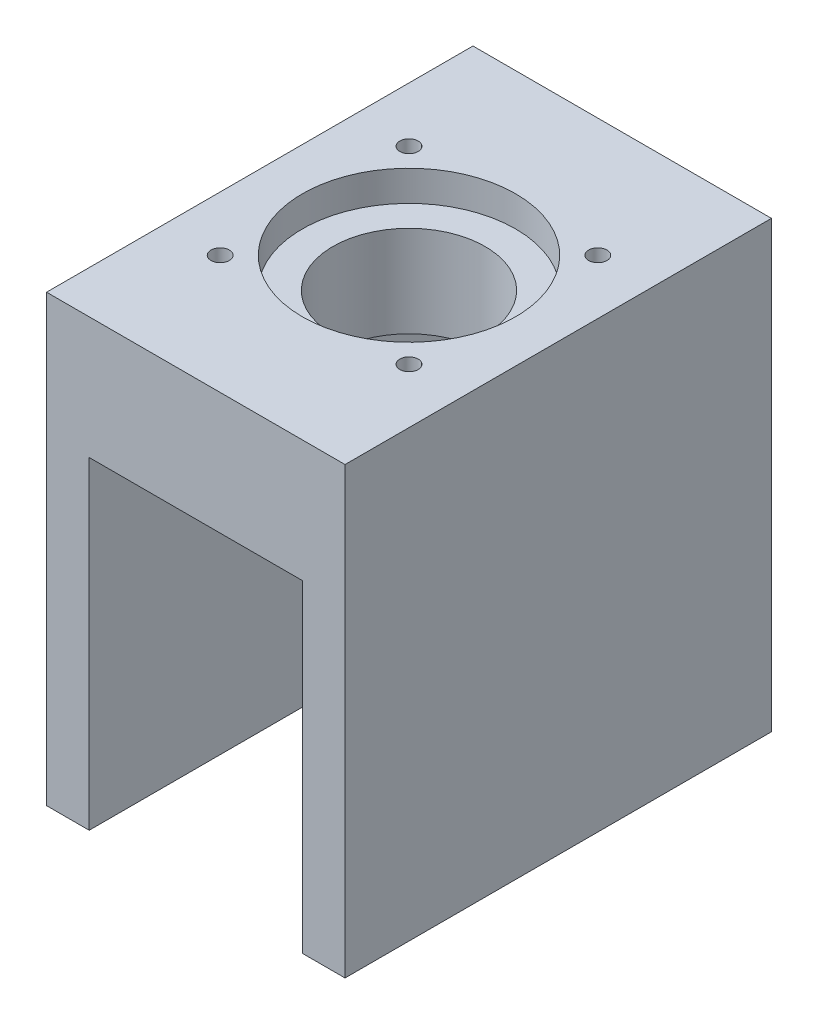
ISO-10303-21;
HEADER;
FILE_DESCRIPTION(('STEP AP214'),'2;1');
FILE_NAME('part.step','',(''),(''),'','','');
FILE_SCHEMA(('AUTOMOTIVE_DESIGN { 1 0 10303 214 1 1 1 1 }'));
ENDSEC;
DATA;
#1=APPLICATION_CONTEXT('core data for automotive mechanical design processes');
#2=APPLICATION_PROTOCOL_DEFINITION('international standard','automotive_design',2000,#1);
#3=PRODUCT_CONTEXT('',#1,'mechanical');
#4=PRODUCT('Part','Part','',(#3));
#5=PRODUCT_RELATED_PRODUCT_CATEGORY('part','',(#4));
#6=PRODUCT_DEFINITION_FORMATION('','',#4);
#7=PRODUCT_DEFINITION_CONTEXT('part definition',#1,'design');
#8=PRODUCT_DEFINITION('design','',#6,#7);
#9=PRODUCT_DEFINITION_SHAPE('','',#8);
#10=(LENGTH_UNIT() NAMED_UNIT(*) SI_UNIT(.MILLI.,.METRE.));
#11=(NAMED_UNIT(*) PLANE_ANGLE_UNIT() SI_UNIT($,.RADIAN.));
#12=(NAMED_UNIT(*) SI_UNIT($,.STERADIAN.) SOLID_ANGLE_UNIT());
#13=UNCERTAINTY_MEASURE_WITH_UNIT(LENGTH_MEASURE(1.E-05),#10,'distance_accuracy_value','');
#14=(GEOMETRIC_REPRESENTATION_CONTEXT(3) GLOBAL_UNCERTAINTY_ASSIGNED_CONTEXT((#13)) GLOBAL_UNIT_ASSIGNED_CONTEXT((#10,
#11,#12)) REPRESENTATION_CONTEXT('',''));
#15=CARTESIAN_POINT('',(0.,0.,0.));
#16=DIRECTION('',(0.,0.,1.));
#17=DIRECTION('',(1.,0.,0.));
#18=AXIS2_PLACEMENT_3D('',#15,#16,#17);
#19=CARTESIAN_POINT('',(0.,0.,0.));
#20=DIRECTION('',(0.,1.,0.));
#21=DIRECTION('',(0.,0.,1.));
#22=AXIS2_PLACEMENT_3D('',#19,#20,#21);
#23=PLANE('',#22);
#24=CARTESIAN_POINT('',(-15.4999999999991,0.,-15.4999999999991));
#25=DIRECTION('',(0.,-1.,0.));
#26=DIRECTION('',(0.,0.,-1.));
#27=AXIS2_PLACEMENT_3D('',#24,#25,#26);
#28=CIRCLE('',#27,1.50000000000093);
#29=CARTESIAN_POINT('',(-15.4999999999991,0.,-17.0000000000001));
#30=VERTEX_POINT('',#29);
#31=EDGE_CURVE('E157',#30,#30,#28,.T.);
#32=ORIENTED_EDGE('',*,*,#31,.F.);
#33=EDGE_LOOP('',(#32));
#34=FACE_BOUND('',#33,.T.);
#35=CARTESIAN_POINT('',(15.5,0.,-15.4999999999991));
#36=DIRECTION('',(0.,-1.,0.));
#37=DIRECTION('',(0.,0.,-1.));
#38=AXIS2_PLACEMENT_3D('',#35,#36,#37);
#39=CIRCLE('',#38,1.50000000000168);
#40=CARTESIAN_POINT('',(15.5,0.,-17.0000000000008));
#41=VERTEX_POINT('',#40);
#42=EDGE_CURVE('E170',#41,#41,#39,.T.);
#43=ORIENTED_EDGE('',*,*,#42,.F.);
#44=EDGE_LOOP('',(#43));
#45=FACE_BOUND('',#44,.T.);
#46=CARTESIAN_POINT('',(15.5,0.,15.5));
#47=DIRECTION('',(0.,-1.,0.));
#48=DIRECTION('',(0.,0.,-1.));
#49=AXIS2_PLACEMENT_3D('',#46,#47,#48);
#50=CIRCLE('',#49,1.50000000000135);
#51=CARTESIAN_POINT('',(15.5,0.,13.9999999999986));
#52=VERTEX_POINT('',#51);
#53=EDGE_CURVE('E164',#52,#52,#50,.T.);
#54=ORIENTED_EDGE('',*,*,#53,.F.);
#55=EDGE_LOOP('',(#54));
#56=FACE_BOUND('',#55,.T.);
#57=CARTESIAN_POINT('',(-15.4999999999991,0.,15.5));
#58=DIRECTION('',(0.,-1.,0.));
#59=DIRECTION('',(0.,0.,-1.));
#60=AXIS2_PLACEMENT_3D('',#57,#58,#59);
#61=CIRCLE('',#60,1.50000000000046);
#62=CARTESIAN_POINT('',(-15.4999999999991,0.,13.9999999999995));
#63=VERTEX_POINT('',#62);
#64=EDGE_CURVE('E163',#63,#63,#61,.T.);
#65=ORIENTED_EDGE('',*,*,#64,.F.);
#66=EDGE_LOOP('',(#65));
#67=FACE_BOUND('',#66,.T.);
#68=CARTESIAN_POINT('',(0.,0.,0.));
#69=DIRECTION('',(0.,1.,0.));
#70=DIRECTION('',(0.,0.,1.));
#71=AXIS2_PLACEMENT_3D('',#68,#69,#70);
#72=CIRCLE('',#71,12.5);
#73=CARTESIAN_POINT('',(0.,0.,12.5));
#74=VERTEX_POINT('',#73);
#75=EDGE_CURVE('E39',#74,#74,#72,.T.);
#76=ORIENTED_EDGE('',*,*,#75,.T.);
#77=EDGE_LOOP('',(#76));
#78=FACE_BOUND('',#77,.T.);
#79=DIRECTION('',(0.,0.,-1.));
#80=VECTOR('',#79,1.);
#81=CARTESIAN_POINT('',(17.5,0.,35.));
#82=LINE('',#81,#80);
#83=CARTESIAN_POINT('',(17.5,0.,35.));
#84=VERTEX_POINT('',#83);
#85=CARTESIAN_POINT('',(17.5,0.,-35.));
#86=VERTEX_POINT('',#85);
#87=EDGE_CURVE('E123',#84,#86,#82,.T.);
#88=ORIENTED_EDGE('',*,*,#87,.F.);
#89=DIRECTION('',(1.,0.,0.));
#90=VECTOR('',#89,1.);
#91=CARTESIAN_POINT('',(24.5,0.,35.));
#92=LINE('',#91,#90);
#93=CARTESIAN_POINT('',(-17.5,0.,35.));
#94=VERTEX_POINT('',#93);
#95=EDGE_CURVE('E192',#94,#84,#92,.T.);
#96=ORIENTED_EDGE('',*,*,#95,.F.);
#97=DIRECTION('',(0.,0.,1.));
#98=VECTOR('',#97,1.);
#99=CARTESIAN_POINT('',(-17.5,0.,35.));
#100=LINE('',#99,#98);
#101=CARTESIAN_POINT('',(-17.5,0.,-35.));
#102=VERTEX_POINT('',#101);
#103=EDGE_CURVE('E131',#102,#94,#100,.T.);
#104=ORIENTED_EDGE('',*,*,#103,.F.);
#105=DIRECTION('',(-1.,0.,0.));
#106=VECTOR('',#105,1.);
#107=CARTESIAN_POINT('',(24.5,0.,-35.));
#108=LINE('',#107,#106);
#109=EDGE_CURVE('E56',#86,#102,#108,.T.);
#110=ORIENTED_EDGE('',*,*,#109,.F.);
#111=EDGE_LOOP('',(#88,#96,#104,#110));
#112=FACE_BOUND('',#111,.T.);
#113=ADVANCED_FACE('F35',(#34,#45,#56,#67,#78,#112),#23,.F.);
#114=CARTESIAN_POINT('',(0.,-50.,0.));
#115=DIRECTION('',(0.,1.,0.));
#116=DIRECTION('',(0.,0.,1.));
#117=AXIS2_PLACEMENT_3D('',#114,#115,#116);
#118=CYLINDRICAL_SURFACE('',#117,12.5);
#119=ORIENTED_EDGE('',*,*,#75,.F.);
#120=EDGE_LOOP('',(#119));
#121=FACE_BOUND('',#120,.T.);
#122=CARTESIAN_POINT('',(0.,15.,0.));
#123=DIRECTION('',(0.,1.,0.));
#124=DIRECTION('',(0.,0.,1.));
#125=AXIS2_PLACEMENT_3D('',#122,#123,#124);
#126=CIRCLE('',#125,12.5);
#127=CARTESIAN_POINT('',(0.,15.,12.5));
#128=VERTEX_POINT('',#127);
#129=EDGE_CURVE('E150',#128,#128,#126,.T.);
#130=ORIENTED_EDGE('',*,*,#129,.T.);
#131=EDGE_LOOP('',(#130));
#132=FACE_BOUND('',#131,.T.);
#133=ADVANCED_FACE('F226',(#121,#132),#118,.F.);
#134=CARTESIAN_POINT('',(-24.5,20.,35.));
#135=DIRECTION('',(1.,0.,0.));
#136=DIRECTION('',(0.,0.,-1.));
#137=AXIS2_PLACEMENT_3D('',#134,#135,#136);
#138=PLANE('',#137);
#139=DIRECTION('',(0.,-1.,0.));
#140=VECTOR('',#139,1.);
#141=CARTESIAN_POINT('',(-24.5,20.,-35.));
#142=LINE('',#141,#140);
#143=CARTESIAN_POINT('',(-24.5,20.,-35.));
#144=VERTEX_POINT('',#143);
#145=CARTESIAN_POINT('',(-24.5,-53.,-35.));
#146=VERTEX_POINT('',#145);
#147=EDGE_CURVE('E191',#144,#146,#142,.T.);
#148=ORIENTED_EDGE('',*,*,#147,.T.);
#149=DIRECTION('',(0.,0.,-1.));
#150=VECTOR('',#149,1.);
#151=CARTESIAN_POINT('',(-24.5,-53.,35.));
#152=LINE('',#151,#150);
#153=CARTESIAN_POINT('',(-24.5,-53.,35.));
#154=VERTEX_POINT('',#153);
#155=EDGE_CURVE('E132',#154,#146,#152,.T.);
#156=ORIENTED_EDGE('',*,*,#155,.F.);
#157=DIRECTION('',(0.,-1.,0.));
#158=VECTOR('',#157,1.);
#159=CARTESIAN_POINT('',(-24.5,20.,35.));
#160=LINE('',#159,#158);
#161=CARTESIAN_POINT('',(-24.5,20.,35.));
#162=VERTEX_POINT('',#161);
#163=EDGE_CURVE('E11',#162,#154,#160,.T.);
#164=ORIENTED_EDGE('',*,*,#163,.F.);
#165=DIRECTION('',(0.,0.,1.));
#166=VECTOR('',#165,1.);
#167=CARTESIAN_POINT('',(-24.5,20.,35.));
#168=LINE('',#167,#166);
#169=EDGE_CURVE('E183',#144,#162,#168,.T.);
#170=ORIENTED_EDGE('',*,*,#169,.F.);
#171=EDGE_LOOP('',(#148,#156,#164,#170));
#172=FACE_BOUND('',#171,.T.);
#173=ADVANCED_FACE('F37',(#172),#138,.F.);
#174=CARTESIAN_POINT('',(24.5,20.,35.));
#175=DIRECTION('',(0.,0.,-1.));
#176=DIRECTION('',(-1.,0.,0.));
#177=AXIS2_PLACEMENT_3D('',#174,#175,#176);
#178=PLANE('',#177);
#179=ORIENTED_EDGE('',*,*,#163,.T.);
#180=DIRECTION('',(-1.,0.,0.));
#181=VECTOR('',#180,1.);
#182=CARTESIAN_POINT('',(-24.5,-53.,35.));
#183=LINE('',#182,#181);
#184=CARTESIAN_POINT('',(-17.5,-53.,35.));
#185=VERTEX_POINT('',#184);
#186=EDGE_CURVE('E139',#185,#154,#183,.T.);
#187=ORIENTED_EDGE('',*,*,#186,.F.);
#188=DIRECTION('',(0.,1.,0.));
#189=VECTOR('',#188,1.);
#190=CARTESIAN_POINT('',(-17.5,-53.,35.));
#191=LINE('',#190,#189);
#192=EDGE_CURVE('E142',#185,#94,#191,.T.);
#193=ORIENTED_EDGE('',*,*,#192,.T.);
#194=ORIENTED_EDGE('',*,*,#95,.T.);
#195=DIRECTION('',(0.,1.,0.));
#196=VECTOR('',#195,1.);
#197=CARTESIAN_POINT('',(17.5,-53.,35.));
#198=LINE('',#197,#196);
#199=CARTESIAN_POINT('',(17.5,-53.,35.));
#200=VERTEX_POINT('',#199);
#201=EDGE_CURVE('E115',#200,#84,#198,.T.);
#202=ORIENTED_EDGE('',*,*,#201,.F.);
#203=DIRECTION('',(-1.,0.,0.));
#204=VECTOR('',#203,1.);
#205=CARTESIAN_POINT('',(24.5,-53.,35.));
#206=LINE('',#205,#204);
#207=CARTESIAN_POINT('',(24.5,-53.,35.));
#208=VERTEX_POINT('',#207);
#209=EDGE_CURVE('E112',#208,#200,#206,.T.);
#210=ORIENTED_EDGE('',*,*,#209,.F.);
#211=DIRECTION('',(0.,-1.,0.));
#212=VECTOR('',#211,1.);
#213=CARTESIAN_POINT('',(24.5,20.,35.));
#214=LINE('',#213,#212);
#215=CARTESIAN_POINT('',(24.5,20.,35.));
#216=VERTEX_POINT('',#215);
#217=EDGE_CURVE('E44',#216,#208,#214,.T.);
#218=ORIENTED_EDGE('',*,*,#217,.F.);
#219=DIRECTION('',(1.,0.,0.));
#220=VECTOR('',#219,1.);
#221=CARTESIAN_POINT('',(24.5,20.,35.));
#222=LINE('',#221,#220);
#223=EDGE_CURVE('E186',#162,#216,#222,.T.);
#224=ORIENTED_EDGE('',*,*,#223,.F.);
#225=EDGE_LOOP('',(#179,#187,#193,#194,#202,#210,#218,#224));
#226=FACE_BOUND('',#225,.T.);
#227=ADVANCED_FACE('F113',(#226),#178,.F.);
#228=CARTESIAN_POINT('',(24.5,20.,35.));
#229=DIRECTION('',(-1.,0.,0.));
#230=DIRECTION('',(0.,0.,1.));
#231=AXIS2_PLACEMENT_3D('',#228,#229,#230);
#232=PLANE('',#231);
#233=ORIENTED_EDGE('',*,*,#217,.T.);
#234=DIRECTION('',(0.,0.,1.));
#235=VECTOR('',#234,1.);
#236=CARTESIAN_POINT('',(24.5,-53.,35.));
#237=LINE('',#236,#235);
#238=CARTESIAN_POINT('',(24.5,-53.,-35.));
#239=VERTEX_POINT('',#238);
#240=EDGE_CURVE('E106',#239,#208,#237,.T.);
#241=ORIENTED_EDGE('',*,*,#240,.F.);
#242=DIRECTION('',(0.,-1.,0.));
#243=VECTOR('',#242,1.);
#244=CARTESIAN_POINT('',(24.5,20.,-35.));
#245=LINE('',#244,#243);
#246=CARTESIAN_POINT('',(24.5,20.,-35.));
#247=VERTEX_POINT('',#246);
#248=EDGE_CURVE('E109',#247,#239,#245,.T.);
#249=ORIENTED_EDGE('',*,*,#248,.F.);
#250=DIRECTION('',(0.,0.,-1.));
#251=VECTOR('',#250,1.);
#252=CARTESIAN_POINT('',(24.5,20.,35.));
#253=LINE('',#252,#251);
#254=EDGE_CURVE('E107',#216,#247,#253,.T.);
#255=ORIENTED_EDGE('',*,*,#254,.F.);
#256=EDGE_LOOP('',(#233,#241,#249,#255));
#257=FACE_BOUND('',#256,.T.);
#258=ADVANCED_FACE('F103',(#257),#232,.F.);
#259=CARTESIAN_POINT('',(24.5,20.,-35.));
#260=DIRECTION('',(0.,0.,1.));
#261=DIRECTION('',(1.,0.,0.));
#262=AXIS2_PLACEMENT_3D('',#259,#260,#261);
#263=PLANE('',#262);
#264=ORIENTED_EDGE('',*,*,#248,.T.);
#265=DIRECTION('',(1.,0.,0.));
#266=VECTOR('',#265,1.);
#267=CARTESIAN_POINT('',(24.5,-53.,-35.));
#268=LINE('',#267,#266);
#269=CARTESIAN_POINT('',(17.5,-53.,-35.));
#270=VERTEX_POINT('',#269);
#271=EDGE_CURVE('E122',#270,#239,#268,.T.);
#272=ORIENTED_EDGE('',*,*,#271,.F.);
#273=DIRECTION('',(0.,1.,0.));
#274=VECTOR('',#273,1.);
#275=CARTESIAN_POINT('',(17.5,-53.,-35.));
#276=LINE('',#275,#274);
#277=EDGE_CURVE('E51',#270,#86,#276,.T.);
#278=ORIENTED_EDGE('',*,*,#277,.T.);
#279=ORIENTED_EDGE('',*,*,#109,.T.);
#280=DIRECTION('',(0.,1.,0.));
#281=VECTOR('',#280,1.);
#282=CARTESIAN_POINT('',(-17.5,-53.,-35.));
#283=LINE('',#282,#281);
#284=CARTESIAN_POINT('',(-17.5,-53.,-35.));
#285=VERTEX_POINT('',#284);
#286=EDGE_CURVE('E147',#285,#102,#283,.T.);
#287=ORIENTED_EDGE('',*,*,#286,.F.);
#288=DIRECTION('',(1.,0.,0.));
#289=VECTOR('',#288,1.);
#290=CARTESIAN_POINT('',(-24.5,-53.,-35.));
#291=LINE('',#290,#289);
#292=EDGE_CURVE('E135',#146,#285,#291,.T.);
#293=ORIENTED_EDGE('',*,*,#292,.F.);
#294=ORIENTED_EDGE('',*,*,#147,.F.);
#295=DIRECTION('',(-1.,0.,0.));
#296=VECTOR('',#295,1.);
#297=CARTESIAN_POINT('',(24.5,20.,-35.));
#298=LINE('',#297,#296);
#299=EDGE_CURVE('E189',#247,#144,#298,.T.);
#300=ORIENTED_EDGE('',*,*,#299,.F.);
#301=EDGE_LOOP('',(#264,#272,#278,#279,#287,#293,#294,#300));
#302=FACE_BOUND('',#301,.T.);
#303=ADVANCED_FACE('F197',(#302),#263,.F.);
#304=CARTESIAN_POINT('',(0.,20.,0.));
#305=DIRECTION('',(0.,1.,0.));
#306=DIRECTION('',(0.,0.,1.));
#307=AXIS2_PLACEMENT_3D('',#304,#305,#306);
#308=PLANE('',#307);
#309=CARTESIAN_POINT('',(0.,20.,0.));
#310=DIRECTION('',(0.,1.,0.));
#311=DIRECTION('',(0.,0.,1.));
#312=AXIS2_PLACEMENT_3D('',#309,#310,#311);
#313=CIRCLE('',#312,17.5);
#314=CARTESIAN_POINT('',(0.,20.,17.5));
#315=VERTEX_POINT('',#314);
#316=EDGE_CURVE('E153',#315,#315,#313,.T.);
#317=ORIENTED_EDGE('',*,*,#316,.F.);
#318=EDGE_LOOP('',(#317));
#319=FACE_BOUND('',#318,.T.);
#320=CARTESIAN_POINT('',(-15.4999999999991,20.,-15.4999999999991));
#321=DIRECTION('',(0.,-1.,0.));
#322=DIRECTION('',(0.,0.,-1.));
#323=AXIS2_PLACEMENT_3D('',#320,#321,#322);
#324=CIRCLE('',#323,1.50000000000093);
#325=CARTESIAN_POINT('',(-15.4999999999991,20.,-17.0000000000001));
#326=VERTEX_POINT('',#325);
#327=EDGE_CURVE('E173',#326,#326,#324,.T.);
#328=ORIENTED_EDGE('',*,*,#327,.T.);
#329=EDGE_LOOP('',(#328));
#330=FACE_BOUND('',#329,.T.);
#331=CARTESIAN_POINT('',(15.5,20.,-15.4999999999991));
#332=DIRECTION('',(0.,-1.,0.));
#333=DIRECTION('',(0.,0.,-1.));
#334=AXIS2_PLACEMENT_3D('',#331,#332,#333);
#335=CIRCLE('',#334,1.50000000000168);
#336=CARTESIAN_POINT('',(15.5,20.,-17.0000000000008));
#337=VERTEX_POINT('',#336);
#338=EDGE_CURVE('E167',#337,#337,#335,.T.);
#339=ORIENTED_EDGE('',*,*,#338,.T.);
#340=EDGE_LOOP('',(#339));
#341=FACE_BOUND('',#340,.T.);
#342=CARTESIAN_POINT('',(15.5,20.,15.5));
#343=DIRECTION('',(0.,-1.,0.));
#344=DIRECTION('',(0.,0.,-1.));
#345=AXIS2_PLACEMENT_3D('',#342,#343,#344);
#346=CIRCLE('',#345,1.50000000000135);
#347=CARTESIAN_POINT('',(15.5,20.,13.9999999999986));
#348=VERTEX_POINT('',#347);
#349=EDGE_CURVE('E160',#348,#348,#346,.T.);
#350=ORIENTED_EDGE('',*,*,#349,.T.);
#351=EDGE_LOOP('',(#350));
#352=FACE_BOUND('',#351,.T.);
#353=CARTESIAN_POINT('',(-15.4999999999991,20.,15.5));
#354=DIRECTION('',(0.,-1.,0.));
#355=DIRECTION('',(0.,0.,-1.));
#356=AXIS2_PLACEMENT_3D('',#353,#354,#355);
#357=CIRCLE('',#356,1.50000000000046);
#358=CARTESIAN_POINT('',(-15.4999999999991,20.,13.9999999999995));
#359=VERTEX_POINT('',#358);
#360=EDGE_CURVE('E178',#359,#359,#357,.T.);
#361=ORIENTED_EDGE('',*,*,#360,.T.);
#362=EDGE_LOOP('',(#361));
#363=FACE_BOUND('',#362,.T.);
#364=ORIENTED_EDGE('',*,*,#169,.T.);
#365=ORIENTED_EDGE('',*,*,#223,.T.);
#366=ORIENTED_EDGE('',*,*,#254,.T.);
#367=ORIENTED_EDGE('',*,*,#299,.T.);
#368=EDGE_LOOP('',(#364,#365,#366,#367));
#369=FACE_BOUND('',#368,.T.);
#370=ADVANCED_FACE('F202',(#319,#330,#341,#352,#363,#369),#308,.T.);
#371=CARTESIAN_POINT('',(-15.4999999999991,20.,15.5));
#372=DIRECTION('',(0.,-1.,0.));
#373=DIRECTION('',(0.,0.,-1.));
#374=AXIS2_PLACEMENT_3D('',#371,#372,#373);
#375=CYLINDRICAL_SURFACE('',#374,1.50000000000046);
#376=ORIENTED_EDGE('',*,*,#360,.F.);
#377=EDGE_LOOP('',(#376));
#378=FACE_BOUND('',#377,.T.);
#379=ORIENTED_EDGE('',*,*,#64,.T.);
#380=EDGE_LOOP('',(#379));
#381=FACE_BOUND('',#380,.T.);
#382=ADVANCED_FACE('F267',(#378,#381),#375,.F.);
#383=CARTESIAN_POINT('',(15.5,20.,15.5));
#384=DIRECTION('',(0.,-1.,0.));
#385=DIRECTION('',(0.,0.,-1.));
#386=AXIS2_PLACEMENT_3D('',#383,#384,#385);
#387=CYLINDRICAL_SURFACE('',#386,1.50000000000135);
#388=ORIENTED_EDGE('',*,*,#349,.F.);
#389=EDGE_LOOP('',(#388));
#390=FACE_BOUND('',#389,.T.);
#391=ORIENTED_EDGE('',*,*,#53,.T.);
#392=EDGE_LOOP('',(#391));
#393=FACE_BOUND('',#392,.T.);
#394=ADVANCED_FACE('F355',(#390,#393),#387,.F.);
#395=CARTESIAN_POINT('',(15.5,20.,-15.4999999999991));
#396=DIRECTION('',(0.,-1.,0.));
#397=DIRECTION('',(0.,0.,-1.));
#398=AXIS2_PLACEMENT_3D('',#395,#396,#397);
#399=CYLINDRICAL_SURFACE('',#398,1.50000000000168);
#400=ORIENTED_EDGE('',*,*,#338,.F.);
#401=EDGE_LOOP('',(#400));
#402=FACE_BOUND('',#401,.T.);
#403=ORIENTED_EDGE('',*,*,#42,.T.);
#404=EDGE_LOOP('',(#403));
#405=FACE_BOUND('',#404,.T.);
#406=ADVANCED_FACE('F358',(#402,#405),#399,.F.);
#407=CARTESIAN_POINT('',(-15.4999999999991,20.,-15.4999999999991));
#408=DIRECTION('',(0.,-1.,0.));
#409=DIRECTION('',(0.,0.,-1.));
#410=AXIS2_PLACEMENT_3D('',#407,#408,#409);
#411=CYLINDRICAL_SURFACE('',#410,1.50000000000093);
#412=ORIENTED_EDGE('',*,*,#327,.F.);
#413=EDGE_LOOP('',(#412));
#414=FACE_BOUND('',#413,.T.);
#415=ORIENTED_EDGE('',*,*,#31,.T.);
#416=EDGE_LOOP('',(#415));
#417=FACE_BOUND('',#416,.T.);
#418=ADVANCED_FACE('F259',(#414,#417),#411,.F.);
#419=CARTESIAN_POINT('',(0.,15.,0.));
#420=DIRECTION('',(0.,1.,0.));
#421=DIRECTION('',(0.,0.,1.));
#422=AXIS2_PLACEMENT_3D('',#419,#420,#421);
#423=CYLINDRICAL_SURFACE('',#422,17.5);
#424=CARTESIAN_POINT('',(0.,15.,0.));
#425=DIRECTION('',(0.,1.,0.));
#426=DIRECTION('',(0.,0.,1.));
#427=AXIS2_PLACEMENT_3D('',#424,#425,#426);
#428=CIRCLE('',#427,17.5);
#429=CARTESIAN_POINT('',(0.,15.,17.5));
#430=VERTEX_POINT('',#429);
#431=EDGE_CURVE('E154',#430,#430,#428,.T.);
#432=ORIENTED_EDGE('',*,*,#431,.F.);
#433=EDGE_LOOP('',(#432));
#434=FACE_BOUND('',#433,.T.);
#435=ORIENTED_EDGE('',*,*,#316,.T.);
#436=EDGE_LOOP('',(#435));
#437=FACE_BOUND('',#436,.T.);
#438=ADVANCED_FACE('F275',(#434,#437),#423,.F.);
#439=CARTESIAN_POINT('',(0.,15.,0.));
#440=DIRECTION('',(0.,1.,0.));
#441=DIRECTION('',(0.,0.,1.));
#442=AXIS2_PLACEMENT_3D('',#439,#440,#441);
#443=PLANE('',#442);
#444=ORIENTED_EDGE('',*,*,#129,.F.);
#445=EDGE_LOOP('',(#444));
#446=FACE_BOUND('',#445,.T.);
#447=ORIENTED_EDGE('',*,*,#431,.T.);
#448=EDGE_LOOP('',(#447));
#449=FACE_BOUND('',#448,.T.);
#450=ADVANCED_FACE('F279',(#446,#449),#443,.T.);
#451=CARTESIAN_POINT('',(-17.5,-53.,35.));
#452=DIRECTION('',(-1.,0.,0.));
#453=DIRECTION('',(0.,0.,1.));
#454=AXIS2_PLACEMENT_3D('',#451,#452,#453);
#455=PLANE('',#454);
#456=ORIENTED_EDGE('',*,*,#103,.T.);
#457=ORIENTED_EDGE('',*,*,#192,.F.);
#458=DIRECTION('',(0.,0.,1.));
#459=VECTOR('',#458,1.);
#460=CARTESIAN_POINT('',(-17.5,-53.,35.));
#461=LINE('',#460,#459);
#462=EDGE_CURVE('E137',#285,#185,#461,.T.);
#463=ORIENTED_EDGE('',*,*,#462,.F.);
#464=ORIENTED_EDGE('',*,*,#286,.T.);
#465=EDGE_LOOP('',(#456,#457,#463,#464));
#466=FACE_BOUND('',#465,.T.);
#467=ADVANCED_FACE('F212',(#466),#455,.F.);
#468=CARTESIAN_POINT('',(0.,-53.,0.));
#469=DIRECTION('',(0.,-1.,0.));
#470=DIRECTION('',(0.,0.,-1.));
#471=AXIS2_PLACEMENT_3D('',#468,#469,#470);
#472=PLANE('',#471);
#473=ORIENTED_EDGE('',*,*,#155,.T.);
#474=ORIENTED_EDGE('',*,*,#292,.T.);
#475=ORIENTED_EDGE('',*,*,#462,.T.);
#476=ORIENTED_EDGE('',*,*,#186,.T.);
#477=EDGE_LOOP('',(#473,#474,#475,#476));
#478=FACE_BOUND('',#477,.T.);
#479=ADVANCED_FACE('F208',(#478),#472,.T.);
#480=CARTESIAN_POINT('',(17.5,-53.,35.));
#481=DIRECTION('',(1.,0.,0.));
#482=DIRECTION('',(0.,0.,-1.));
#483=AXIS2_PLACEMENT_3D('',#480,#481,#482);
#484=PLANE('',#483);
#485=ORIENTED_EDGE('',*,*,#87,.T.);
#486=ORIENTED_EDGE('',*,*,#277,.F.);
#487=DIRECTION('',(0.,0.,-1.));
#488=VECTOR('',#487,1.);
#489=CARTESIAN_POINT('',(17.5,-53.,35.));
#490=LINE('',#489,#488);
#491=EDGE_CURVE('E118',#200,#270,#490,.T.);
#492=ORIENTED_EDGE('',*,*,#491,.F.);
#493=ORIENTED_EDGE('',*,*,#201,.T.);
#494=EDGE_LOOP('',(#485,#486,#492,#493));
#495=FACE_BOUND('',#494,.T.);
#496=ADVANCED_FACE('F216',(#495),#484,.F.);
#497=CARTESIAN_POINT('',(0.,-53.,0.));
#498=DIRECTION('',(0.,1.,0.));
#499=DIRECTION('',(0.,0.,1.));
#500=AXIS2_PLACEMENT_3D('',#497,#498,#499);
#501=PLANE('',#500);
#502=ORIENTED_EDGE('',*,*,#240,.T.);
#503=ORIENTED_EDGE('',*,*,#209,.T.);
#504=ORIENTED_EDGE('',*,*,#491,.T.);
#505=ORIENTED_EDGE('',*,*,#271,.T.);
#506=EDGE_LOOP('',(#502,#503,#504,#505));
#507=FACE_BOUND('',#506,.T.);
#508=ADVANCED_FACE('F121',(#507),#501,.F.);
#509=CLOSED_SHELL('',(#113,#133,#173,#227,#258,#303,#370,#382,#394,#406,#418,#438,#450,#467,
#479,#496,#508));
#510=MANIFOLD_SOLID_BREP('B2',#509);
#511=ADVANCED_BREP_SHAPE_REPRESENTATION('',(#18,#510),#14);
#512=SHAPE_DEFINITION_REPRESENTATION(#9,#511);
ENDSEC;
END-ISO-10303-21;
